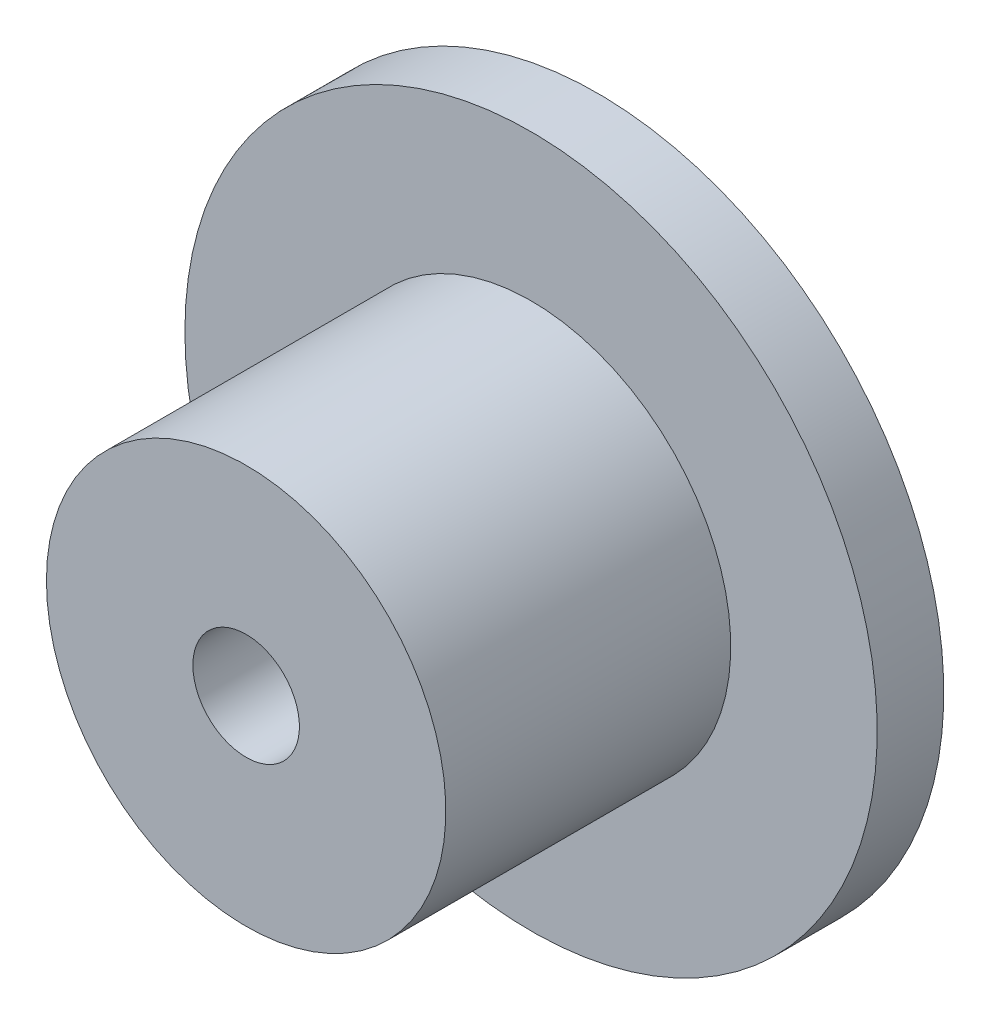
ISO-10303-21;
HEADER;
FILE_DESCRIPTION(('STEP AP214'),'2;1');
FILE_NAME('part.step','',(''),(''),'','','');
FILE_SCHEMA(('AUTOMOTIVE_DESIGN { 1 0 10303 214 1 1 1 1 }'));
ENDSEC;
DATA;
#1=APPLICATION_CONTEXT('core data for automotive mechanical design processes');
#2=APPLICATION_PROTOCOL_DEFINITION('international standard','automotive_design',2000,#1);
#3=PRODUCT_CONTEXT('',#1,'mechanical');
#4=PRODUCT('Part','Part','',(#3));
#5=PRODUCT_RELATED_PRODUCT_CATEGORY('part','',(#4));
#6=PRODUCT_DEFINITION_FORMATION('','',#4);
#7=PRODUCT_DEFINITION_CONTEXT('part definition',#1,'design');
#8=PRODUCT_DEFINITION('design','',#6,#7);
#9=PRODUCT_DEFINITION_SHAPE('','',#8);
#10=(LENGTH_UNIT() NAMED_UNIT(*) SI_UNIT(.MILLI.,.METRE.));
#11=(NAMED_UNIT(*) PLANE_ANGLE_UNIT() SI_UNIT($,.RADIAN.));
#12=(NAMED_UNIT(*) SI_UNIT($,.STERADIAN.) SOLID_ANGLE_UNIT());
#13=UNCERTAINTY_MEASURE_WITH_UNIT(LENGTH_MEASURE(1.E-05),#10,'distance_accuracy_value','');
#14=(GEOMETRIC_REPRESENTATION_CONTEXT(3) GLOBAL_UNCERTAINTY_ASSIGNED_CONTEXT((#13)) GLOBAL_UNIT_ASSIGNED_CONTEXT((#10,
#11,#12)) REPRESENTATION_CONTEXT('',''));
#15=CARTESIAN_POINT('',(0.,0.,0.));
#16=DIRECTION('',(0.,0.,1.));
#17=DIRECTION('',(1.,0.,0.));
#18=AXIS2_PLACEMENT_3D('',#15,#16,#17);
#19=CARTESIAN_POINT('',(0.,0.,15.7));
#20=DIRECTION('',(0.,0.,1.));
#21=DIRECTION('',(1.,0.,0.));
#22=AXIS2_PLACEMENT_3D('',#19,#20,#21);
#23=CYLINDRICAL_SURFACE('',#22,15.);
#24=CARTESIAN_POINT('',(0.,0.,26.4));
#25=DIRECTION('',(0.,0.,1.));
#26=DIRECTION('',(1.,0.,0.));
#27=AXIS2_PLACEMENT_3D('',#24,#25,#26);
#28=CIRCLE('',#27,15.);
#29=CARTESIAN_POINT('',(-15.,0.,26.4));
#30=VERTEX_POINT('',#29);
#31=EDGE_CURVE('E62',#30,#30,#28,.T.);
#32=ORIENTED_EDGE('',*,*,#31,.F.);
#33=DIRECTION('',(0.,0.,-1.));
#34=VECTOR('',#33,1.);
#35=CARTESIAN_POINT('',(-15.,0.,15.7));
#36=LINE('',#35,#34);
#37=CARTESIAN_POINT('',(-15.,0.,5.));
#38=VERTEX_POINT('',#37);
#39=EDGE_CURVE('E11',#30,#38,#36,.T.);
#40=ORIENTED_EDGE('',*,*,#39,.T.);
#41=CARTESIAN_POINT('',(0.,0.,5.));
#42=DIRECTION('',(0.,0.,1.));
#43=DIRECTION('',(1.,0.,0.));
#44=AXIS2_PLACEMENT_3D('',#41,#42,#43);
#45=CIRCLE('',#44,15.);
#46=EDGE_CURVE('E26',#38,#38,#45,.T.);
#47=ORIENTED_EDGE('',*,*,#46,.T.);
#48=ORIENTED_EDGE('',*,*,#39,.F.);
#49=EDGE_LOOP('',(#32,#40,#47,#48));
#50=FACE_BOUND('',#49,.T.);
#51=ADVANCED_FACE('F17',(#50),#23,.T.);
#52=CARTESIAN_POINT('',(15.,0.,5.));
#53=DIRECTION('',(0.,0.,1.));
#54=DIRECTION('',(1.,0.,0.));
#55=AXIS2_PLACEMENT_3D('',#52,#53,#54);
#56=PLANE('',#55);
#57=ORIENTED_EDGE('',*,*,#46,.F.);
#58=EDGE_LOOP('',(#57));
#59=FACE_BOUND('',#58,.T.);
#60=CARTESIAN_POINT('',(0.,0.,5.00000007450581));
#61=DIRECTION('',(0.,0.,1.));
#62=DIRECTION('',(1.,0.,0.));
#63=AXIS2_PLACEMENT_3D('',#60,#61,#62);
#64=CIRCLE('',#63,26.);
#65=CARTESIAN_POINT('',(-26.,0.,5.00000007450581));
#66=VERTEX_POINT('',#65);
#67=EDGE_CURVE('E77',#66,#66,#64,.T.);
#68=ORIENTED_EDGE('',*,*,#67,.T.);
#69=EDGE_LOOP('',(#68));
#70=FACE_BOUND('',#69,.T.);
#71=ADVANCED_FACE('F19',(#59,#70),#56,.T.);
#72=CARTESIAN_POINT('',(0.,0.,2.5000000372529));
#73=DIRECTION('',(0.,0.,1.));
#74=DIRECTION('',(1.,0.,0.));
#75=AXIS2_PLACEMENT_3D('',#72,#73,#74);
#76=CYLINDRICAL_SURFACE('',#75,26.);
#77=ORIENTED_EDGE('',*,*,#67,.F.);
#78=DIRECTION('',(0.,0.,-1.));
#79=VECTOR('',#78,1.);
#80=CARTESIAN_POINT('',(-26.,0.,2.5000000372529));
#81=LINE('',#80,#79);
#82=CARTESIAN_POINT('',(-26.,0.,0.));
#83=VERTEX_POINT('',#82);
#84=EDGE_CURVE('E47',#66,#83,#81,.T.);
#85=ORIENTED_EDGE('',*,*,#84,.T.);
#86=CARTESIAN_POINT('',(0.,0.,0.));
#87=DIRECTION('',(0.,0.,1.));
#88=DIRECTION('',(1.,0.,0.));
#89=AXIS2_PLACEMENT_3D('',#86,#87,#88);
#90=CIRCLE('',#89,26.);
#91=EDGE_CURVE('E80',#83,#83,#90,.T.);
#92=ORIENTED_EDGE('',*,*,#91,.T.);
#93=ORIENTED_EDGE('',*,*,#84,.F.);
#94=EDGE_LOOP('',(#77,#85,#92,#93));
#95=FACE_BOUND('',#94,.T.);
#96=ADVANCED_FACE('F141',(#95),#76,.T.);
#97=CARTESIAN_POINT('',(26.,0.,0.));
#98=DIRECTION('',(0.,0.,-1.));
#99=DIRECTION('',(0.,-1.,0.));
#100=AXIS2_PLACEMENT_3D('',#97,#98,#99);
#101=PLANE('',#100);
#102=CARTESIAN_POINT('',(0.,0.,0.));
#103=DIRECTION('',(0.,0.,1.));
#104=DIRECTION('',(1.,0.,0.));
#105=AXIS2_PLACEMENT_3D('',#102,#103,#104);
#106=CIRCLE('',#105,4.);
#107=CARTESIAN_POINT('',(-4.,0.,0.));
#108=VERTEX_POINT('',#107);
#109=EDGE_CURVE('E78',#108,#108,#106,.T.);
#110=ORIENTED_EDGE('',*,*,#109,.T.);
#111=EDGE_LOOP('',(#110));
#112=FACE_BOUND('',#111,.T.);
#113=ORIENTED_EDGE('',*,*,#91,.F.);
#114=EDGE_LOOP('',(#113));
#115=FACE_BOUND('',#114,.T.);
#116=ADVANCED_FACE('F132',(#112,#115),#101,.T.);
#117=CARTESIAN_POINT('',(0.,0.,13.2));
#118=DIRECTION('',(0.,0.,1.));
#119=DIRECTION('',(1.,0.,0.));
#120=AXIS2_PLACEMENT_3D('',#117,#118,#119);
#121=CYLINDRICAL_SURFACE('',#120,4.);
#122=CARTESIAN_POINT('',(0.,0.,26.4));
#123=DIRECTION('',(0.,0.,1.));
#124=DIRECTION('',(1.,0.,0.));
#125=AXIS2_PLACEMENT_3D('',#122,#123,#124);
#126=CIRCLE('',#125,4.);
#127=CARTESIAN_POINT('',(-4.,0.,26.4));
#128=VERTEX_POINT('',#127);
#129=EDGE_CURVE('E67',#128,#128,#126,.T.);
#130=ORIENTED_EDGE('',*,*,#129,.T.);
#131=DIRECTION('',(0.,0.,-1.));
#132=VECTOR('',#131,1.);
#133=CARTESIAN_POINT('',(-4.,0.,13.2));
#134=LINE('',#133,#132);
#135=EDGE_CURVE('E73',#128,#108,#134,.T.);
#136=ORIENTED_EDGE('',*,*,#135,.T.);
#137=ORIENTED_EDGE('',*,*,#109,.F.);
#138=ORIENTED_EDGE('',*,*,#135,.F.);
#139=EDGE_LOOP('',(#130,#136,#137,#138));
#140=FACE_BOUND('',#139,.T.);
#141=ADVANCED_FACE('F115',(#140),#121,.F.);
#142=CARTESIAN_POINT('',(4.,0.,26.4));
#143=DIRECTION('',(0.,0.,1.));
#144=DIRECTION('',(1.,0.,0.));
#145=AXIS2_PLACEMENT_3D('',#142,#143,#144);
#146=PLANE('',#145);
#147=ORIENTED_EDGE('',*,*,#129,.F.);
#148=EDGE_LOOP('',(#147));
#149=FACE_BOUND('',#148,.T.);
#150=ORIENTED_EDGE('',*,*,#31,.T.);
#151=EDGE_LOOP('',(#150));
#152=FACE_BOUND('',#151,.T.);
#153=ADVANCED_FACE('F65',(#149,#152),#146,.T.);
#154=CLOSED_SHELL('',(#51,#71,#96,#116,#141,#153));
#155=MANIFOLD_SOLID_BREP('B1',#154);
#156=ADVANCED_BREP_SHAPE_REPRESENTATION('',(#18,#155),#14);
#157=SHAPE_DEFINITION_REPRESENTATION(#9,#156);
ENDSEC;
END-ISO-10303-21;
